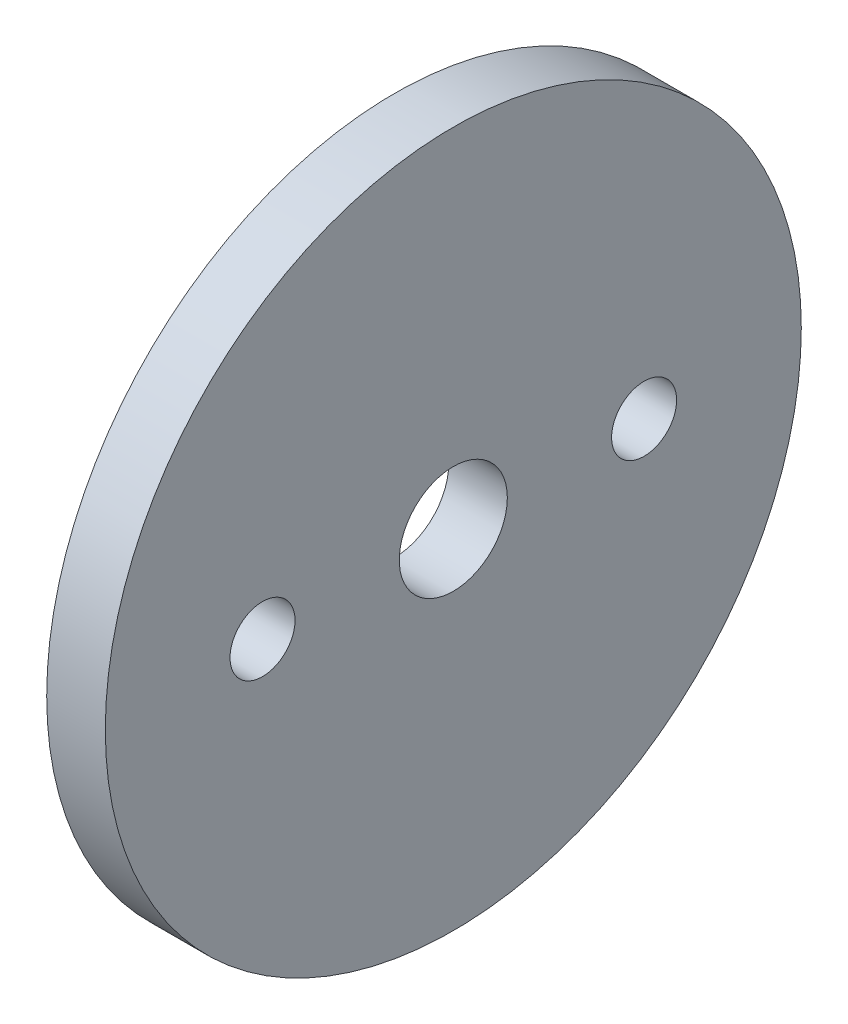
ISO-10303-21;
HEADER;
FILE_DESCRIPTION(('STEP AP214'),'2;1');
FILE_NAME('part.step','',(''),(''),'','','');
FILE_SCHEMA(('AUTOMOTIVE_DESIGN { 1 0 10303 214 1 1 1 1 }'));
ENDSEC;
DATA;
#1=APPLICATION_CONTEXT('core data for automotive mechanical design processes');
#2=APPLICATION_PROTOCOL_DEFINITION('international standard','automotive_design',2000,#1);
#3=PRODUCT_CONTEXT('',#1,'mechanical');
#4=PRODUCT('Part','Part','',(#3));
#5=PRODUCT_RELATED_PRODUCT_CATEGORY('part','',(#4));
#6=PRODUCT_DEFINITION_FORMATION('','',#4);
#7=PRODUCT_DEFINITION_CONTEXT('part definition',#1,'design');
#8=PRODUCT_DEFINITION('design','',#6,#7);
#9=PRODUCT_DEFINITION_SHAPE('','',#8);
#10=(LENGTH_UNIT() NAMED_UNIT(*) SI_UNIT(.MILLI.,.METRE.));
#11=(NAMED_UNIT(*) PLANE_ANGLE_UNIT() SI_UNIT($,.RADIAN.));
#12=(NAMED_UNIT(*) SI_UNIT($,.STERADIAN.) SOLID_ANGLE_UNIT());
#13=UNCERTAINTY_MEASURE_WITH_UNIT(LENGTH_MEASURE(1.E-05),#10,'distance_accuracy_value','');
#14=(GEOMETRIC_REPRESENTATION_CONTEXT(3) GLOBAL_UNCERTAINTY_ASSIGNED_CONTEXT((#13)) GLOBAL_UNIT_ASSIGNED_CONTEXT((#10,
#11,#12)) REPRESENTATION_CONTEXT('',''));
#15=CARTESIAN_POINT('',(0.,0.,0.));
#16=DIRECTION('',(0.,0.,1.));
#17=DIRECTION('',(1.,0.,0.));
#18=AXIS2_PLACEMENT_3D('',#15,#16,#17);
#19=CARTESIAN_POINT('',(2.4384,0.,0.));
#20=DIRECTION('',(-1.,0.,0.));
#21=DIRECTION('',(0.,0.,1.));
#22=AXIS2_PLACEMENT_3D('',#19,#20,#21);
#23=CYLINDRICAL_SURFACE('',#22,14.478);
#24=CARTESIAN_POINT('',(2.4384,0.,0.));
#25=DIRECTION('',(1.,0.,0.));
#26=DIRECTION('',(0.,0.,-1.));
#27=AXIS2_PLACEMENT_3D('',#24,#25,#26);
#28=CIRCLE('',#27,14.478);
#29=CARTESIAN_POINT('',(2.4384,0.,-14.478));
#30=VERTEX_POINT('',#29);
#31=EDGE_CURVE('E10',#30,#30,#28,.T.);
#32=ORIENTED_EDGE('',*,*,#31,.F.);
#33=EDGE_LOOP('',(#32));
#34=FACE_BOUND('',#33,.T.);
#35=CARTESIAN_POINT('',(0.,0.,0.));
#36=DIRECTION('',(1.,0.,0.));
#37=DIRECTION('',(0.,0.,-1.));
#38=AXIS2_PLACEMENT_3D('',#35,#36,#37);
#39=CIRCLE('',#38,14.478);
#40=CARTESIAN_POINT('',(0.,0.,-14.478));
#41=VERTEX_POINT('',#40);
#42=EDGE_CURVE('E46',#41,#41,#39,.T.);
#43=ORIENTED_EDGE('',*,*,#42,.T.);
#44=EDGE_LOOP('',(#43));
#45=FACE_BOUND('',#44,.T.);
#46=ADVANCED_FACE('F43',(#34,#45),#23,.T.);
#47=CARTESIAN_POINT('',(2.4384,0.,0.));
#48=DIRECTION('',(1.,0.,0.));
#49=DIRECTION('',(0.,0.,-1.));
#50=AXIS2_PLACEMENT_3D('',#47,#48,#49);
#51=PLANE('',#50);
#52=CARTESIAN_POINT('',(2.4384,0.,7.9375));
#53=DIRECTION('',(1.,0.,0.));
#54=DIRECTION('',(0.,0.,-1.));
#55=AXIS2_PLACEMENT_3D('',#52,#53,#54);
#56=CIRCLE('',#55,1.35255);
#57=CARTESIAN_POINT('',(2.4384,0.,6.58495));
#58=VERTEX_POINT('',#57);
#59=EDGE_CURVE('E69',#58,#58,#56,.T.);
#60=ORIENTED_EDGE('',*,*,#59,.F.);
#61=EDGE_LOOP('',(#60));
#62=FACE_BOUND('',#61,.T.);
#63=CARTESIAN_POINT('',(2.4384,0.,-7.9375));
#64=DIRECTION('',(1.,0.,0.));
#65=DIRECTION('',(0.,0.,-1.));
#66=AXIS2_PLACEMENT_3D('',#63,#64,#65);
#67=CIRCLE('',#66,1.35255);
#68=CARTESIAN_POINT('',(2.4384,0.,-9.29005));
#69=VERTEX_POINT('',#68);
#70=EDGE_CURVE('E63',#69,#69,#67,.T.);
#71=ORIENTED_EDGE('',*,*,#70,.F.);
#72=EDGE_LOOP('',(#71));
#73=FACE_BOUND('',#72,.T.);
#74=CARTESIAN_POINT('',(2.4384,0.,0.));
#75=DIRECTION('',(1.,0.,0.));
#76=DIRECTION('',(0.,0.,-1.));
#77=AXIS2_PLACEMENT_3D('',#74,#75,#76);
#78=CIRCLE('',#77,2.2479);
#79=CARTESIAN_POINT('',(2.4384,0.,-2.2479));
#80=VERTEX_POINT('',#79);
#81=EDGE_CURVE('E57',#80,#80,#78,.T.);
#82=ORIENTED_EDGE('',*,*,#81,.F.);
#83=EDGE_LOOP('',(#82));
#84=FACE_BOUND('',#83,.T.);
#85=ORIENTED_EDGE('',*,*,#31,.T.);
#86=EDGE_LOOP('',(#85));
#87=FACE_BOUND('',#86,.T.);
#88=ADVANCED_FACE('F75',(#62,#73,#84,#87),#51,.T.);
#89=CARTESIAN_POINT('',(0.,0.,0.));
#90=DIRECTION('',(1.,0.,0.));
#91=DIRECTION('',(0.,0.,-1.));
#92=AXIS2_PLACEMENT_3D('',#89,#90,#91);
#93=PLANE('',#92);
#94=CARTESIAN_POINT('',(0.,0.,7.9375));
#95=DIRECTION('',(1.,0.,0.));
#96=DIRECTION('',(0.,0.,-1.));
#97=AXIS2_PLACEMENT_3D('',#94,#95,#96);
#98=CIRCLE('',#97,1.35255);
#99=CARTESIAN_POINT('',(0.,0.,6.58495));
#100=VERTEX_POINT('',#99);
#101=EDGE_CURVE('E66',#100,#100,#98,.T.);
#102=ORIENTED_EDGE('',*,*,#101,.T.);
#103=EDGE_LOOP('',(#102));
#104=FACE_BOUND('',#103,.T.);
#105=CARTESIAN_POINT('',(0.,0.,-7.9375));
#106=DIRECTION('',(1.,0.,0.));
#107=DIRECTION('',(0.,0.,-1.));
#108=AXIS2_PLACEMENT_3D('',#105,#106,#107);
#109=CIRCLE('',#108,1.35255);
#110=CARTESIAN_POINT('',(0.,0.,-9.29005));
#111=VERTEX_POINT('',#110);
#112=EDGE_CURVE('E60',#111,#111,#109,.T.);
#113=ORIENTED_EDGE('',*,*,#112,.T.);
#114=EDGE_LOOP('',(#113));
#115=FACE_BOUND('',#114,.T.);
#116=CARTESIAN_POINT('',(0.,0.,0.));
#117=DIRECTION('',(1.,0.,0.));
#118=DIRECTION('',(0.,0.,-1.));
#119=AXIS2_PLACEMENT_3D('',#116,#117,#118);
#120=CIRCLE('',#119,2.2479);
#121=CARTESIAN_POINT('',(0.,0.,-2.2479));
#122=VERTEX_POINT('',#121);
#123=EDGE_CURVE('E53',#122,#122,#120,.T.);
#124=ORIENTED_EDGE('',*,*,#123,.T.);
#125=EDGE_LOOP('',(#124));
#126=FACE_BOUND('',#125,.T.);
#127=ORIENTED_EDGE('',*,*,#42,.F.);
#128=EDGE_LOOP('',(#127));
#129=FACE_BOUND('',#128,.T.);
#130=ADVANCED_FACE('F78',(#104,#115,#126,#129),#93,.F.);
#131=CARTESIAN_POINT('',(2.4384,0.,0.));
#132=DIRECTION('',(1.,0.,0.));
#133=DIRECTION('',(0.,0.,-1.));
#134=AXIS2_PLACEMENT_3D('',#131,#132,#133);
#135=CYLINDRICAL_SURFACE('',#134,2.2479);
#136=ORIENTED_EDGE('',*,*,#123,.F.);
#137=EDGE_LOOP('',(#136));
#138=FACE_BOUND('',#137,.T.);
#139=ORIENTED_EDGE('',*,*,#81,.T.);
#140=EDGE_LOOP('',(#139));
#141=FACE_BOUND('',#140,.T.);
#142=ADVANCED_FACE('F84',(#138,#141),#135,.F.);
#143=CARTESIAN_POINT('',(2.4384,0.,-7.9375));
#144=DIRECTION('',(1.,0.,0.));
#145=DIRECTION('',(0.,0.,-1.));
#146=AXIS2_PLACEMENT_3D('',#143,#144,#145);
#147=CYLINDRICAL_SURFACE('',#146,1.35255);
#148=ORIENTED_EDGE('',*,*,#112,.F.);
#149=EDGE_LOOP('',(#148));
#150=FACE_BOUND('',#149,.T.);
#151=ORIENTED_EDGE('',*,*,#70,.T.);
#152=EDGE_LOOP('',(#151));
#153=FACE_BOUND('',#152,.T.);
#154=ADVANCED_FACE('F86',(#150,#153),#147,.F.);
#155=CARTESIAN_POINT('',(2.4384,0.,7.9375));
#156=DIRECTION('',(1.,0.,0.));
#157=DIRECTION('',(0.,0.,-1.));
#158=AXIS2_PLACEMENT_3D('',#155,#156,#157);
#159=CYLINDRICAL_SURFACE('',#158,1.35255);
#160=ORIENTED_EDGE('',*,*,#101,.F.);
#161=EDGE_LOOP('',(#160));
#162=FACE_BOUND('',#161,.T.);
#163=ORIENTED_EDGE('',*,*,#59,.T.);
#164=EDGE_LOOP('',(#163));
#165=FACE_BOUND('',#164,.T.);
#166=ADVANCED_FACE('F73',(#162,#165),#159,.F.);
#167=CLOSED_SHELL('',(#46,#88,#130,#142,#154,#166));
#168=MANIFOLD_SOLID_BREP('B2',#167);
#169=ADVANCED_BREP_SHAPE_REPRESENTATION('',(#18,#168),#14);
#170=SHAPE_DEFINITION_REPRESENTATION(#9,#169);
ENDSEC;
END-ISO-10303-21;
